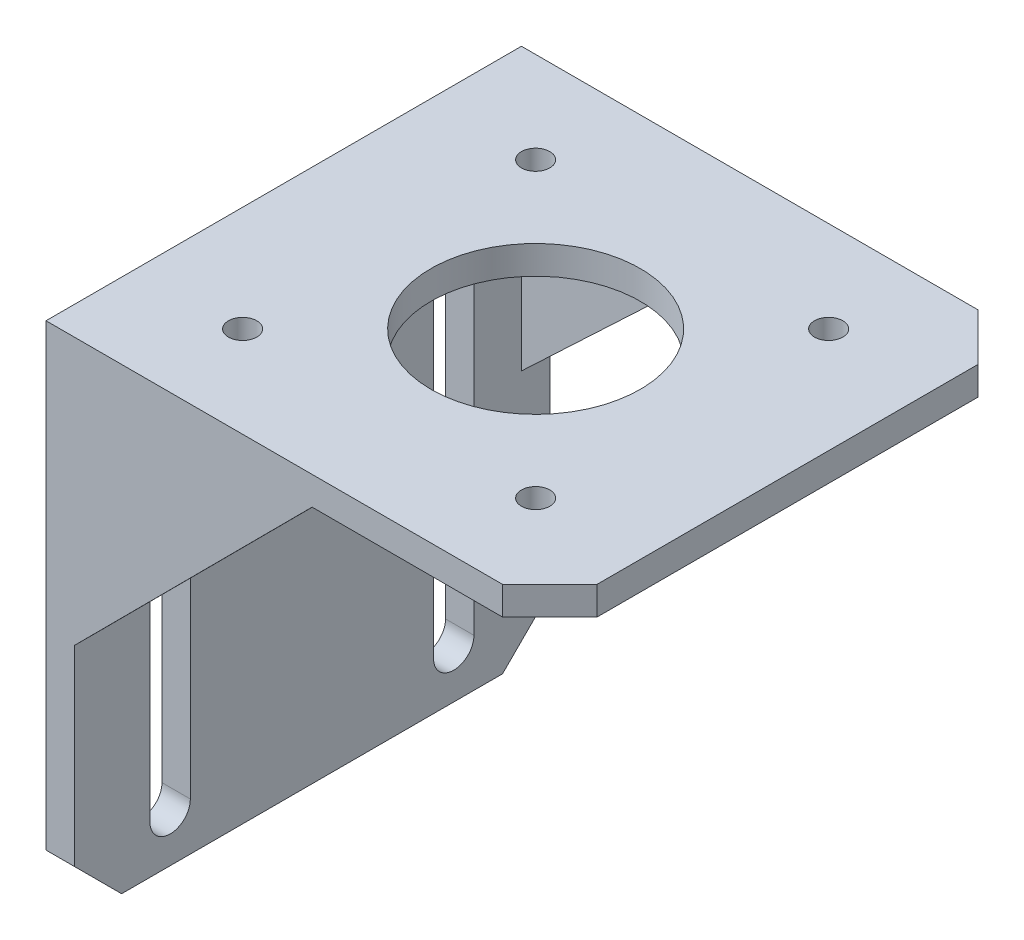
ISO-10303-21;
HEADER;
FILE_DESCRIPTION(('STEP AP214'),'2;1');
FILE_NAME('part.step','',(''),(''),'','','');
FILE_SCHEMA(('AUTOMOTIVE_DESIGN { 1 0 10303 214 1 1 1 1 }'));
ENDSEC;
DATA;
#1=APPLICATION_CONTEXT('core data for automotive mechanical design processes');
#2=APPLICATION_PROTOCOL_DEFINITION('international standard','automotive_design',2000,#1);
#3=PRODUCT_CONTEXT('',#1,'mechanical');
#4=PRODUCT('Part','Part','',(#3));
#5=PRODUCT_RELATED_PRODUCT_CATEGORY('part','',(#4));
#6=PRODUCT_DEFINITION_FORMATION('','',#4);
#7=PRODUCT_DEFINITION_CONTEXT('part definition',#1,'design');
#8=PRODUCT_DEFINITION('design','',#6,#7);
#9=PRODUCT_DEFINITION_SHAPE('','',#8);
#10=(LENGTH_UNIT() NAMED_UNIT(*) SI_UNIT(.MILLI.,.METRE.));
#11=(NAMED_UNIT(*) PLANE_ANGLE_UNIT() SI_UNIT($,.RADIAN.));
#12=(NAMED_UNIT(*) SI_UNIT($,.STERADIAN.) SOLID_ANGLE_UNIT());
#13=UNCERTAINTY_MEASURE_WITH_UNIT(LENGTH_MEASURE(1.E-05),#10,'distance_accuracy_value','');
#14=(GEOMETRIC_REPRESENTATION_CONTEXT(3) GLOBAL_UNCERTAINTY_ASSIGNED_CONTEXT((#13)) GLOBAL_UNIT_ASSIGNED_CONTEXT((#10,
#11,#12)) REPRESENTATION_CONTEXT('',''));
#15=CARTESIAN_POINT('',(0.,0.,0.));
#16=DIRECTION('',(0.,0.,1.));
#17=DIRECTION('',(1.,0.,0.));
#18=AXIS2_PLACEMENT_3D('',#15,#16,#17);
#19=CARTESIAN_POINT('',(3.,0.,0.));
#20=DIRECTION('',(1.,0.,0.));
#21=DIRECTION('',(0.,0.,-1.));
#22=AXIS2_PLACEMENT_3D('',#19,#20,#21);
#23=PLANE('',#22);
#24=DIRECTION('',(0.,0.,-1.));
#25=VECTOR('',#24,1.);
#26=CARTESIAN_POINT('',(3.,-29.863798217859,14.9988582977588));
#27=LINE('',#26,#25);
#28=CARTESIAN_POINT('',(3.,-29.863798217859,9.99885829775879));
#29=VERTEX_POINT('',#28);
#30=CARTESIAN_POINT('',(3.,-29.863798217859,-30.3011417022412));
#31=VERTEX_POINT('',#30);
#32=EDGE_CURVE('E310',#29,#31,#27,.T.);
#33=ORIENTED_EDGE('',*,*,#32,.T.);
#34=DIRECTION('',(0.,-0.707106781186547,0.707106781186549));
#35=VECTOR('',#34,1.);
#36=CARTESIAN_POINT('',(3.,-30.0824699600502,-30.0824699600501));
#37=LINE('',#36,#35);
#38=CARTESIAN_POINT('',(3.,-24.863798217859,-35.3011417022412));
#39=VERTEX_POINT('',#38);
#40=EDGE_CURVE('E11',#31,#39,#37,.F.);
#41=ORIENTED_EDGE('',*,*,#40,.T.);
#42=DIRECTION('',(0.,1.,0.));
#43=VECTOR('',#42,1.);
#44=CARTESIAN_POINT('',(3.,23.636201782141,-35.3011417022412));
#45=LINE('',#44,#43);
#46=CARTESIAN_POINT('',(3.,-3.113798217859,-35.3011417022412));
#47=VERTEX_POINT('',#46);
#48=EDGE_CURVE('E313',#39,#47,#45,.T.);
#49=ORIENTED_EDGE('',*,*,#48,.T.);
#50=DIRECTION('',(0.,0.,-1.));
#51=VECTOR('',#50,1.);
#52=CARTESIAN_POINT('',(3.,-3.11379821785901,-32.3011417022412));
#53=LINE('',#52,#51);
#54=CARTESIAN_POINT('',(3.,-3.11379821785901,-32.3011417022412));
#55=VERTEX_POINT('',#54);
#56=EDGE_CURVE('E197',#55,#47,#53,.T.);
#57=ORIENTED_EDGE('',*,*,#56,.F.);
#58=DIRECTION('',(0.,-1.,0.));
#59=VECTOR('',#58,1.);
#60=CARTESIAN_POINT('',(3.,20.636201782141,-32.3011417022412));
#61=LINE('',#60,#59);
#62=CARTESIAN_POINT('',(3.,20.636201782141,-32.3011417022412));
#63=VERTEX_POINT('',#62);
#64=EDGE_CURVE('E198',#63,#55,#61,.T.);
#65=ORIENTED_EDGE('',*,*,#64,.F.);
#66=DIRECTION('',(0.,0.,-1.));
#67=VECTOR('',#66,1.);
#68=CARTESIAN_POINT('',(3.,20.636201782141,14.9988582977588));
#69=LINE('',#68,#67);
#70=CARTESIAN_POINT('',(3.,20.636201782141,11.9988582977588));
#71=VERTEX_POINT('',#70);
#72=EDGE_CURVE('E209',#71,#63,#69,.T.);
#73=ORIENTED_EDGE('',*,*,#72,.F.);
#74=DIRECTION('',(0.,-1.,0.));
#75=VECTOR('',#74,1.);
#76=CARTESIAN_POINT('',(3.,20.636201782141,11.9988582977588));
#77=LINE('',#76,#75);
#78=CARTESIAN_POINT('',(3.,-4.613798217859,11.9988582977588));
#79=VERTEX_POINT('',#78);
#80=EDGE_CURVE('E222',#71,#79,#77,.T.);
#81=ORIENTED_EDGE('',*,*,#80,.T.);
#82=DIRECTION('',(0.,0.,1.));
#83=VECTOR('',#82,1.);
#84=CARTESIAN_POINT('',(3.,-4.613798217859,11.9988582977588));
#85=LINE('',#84,#83);
#86=CARTESIAN_POINT('',(3.,-4.613798217859,14.9988582977588));
#87=VERTEX_POINT('',#86);
#88=EDGE_CURVE('E227',#79,#87,#85,.T.);
#89=ORIENTED_EDGE('',*,*,#88,.T.);
#90=DIRECTION('',(0.,-1.,0.));
#91=VECTOR('',#90,1.);
#92=CARTESIAN_POINT('',(3.,23.636201782141,14.9988582977588));
#93=LINE('',#92,#91);
#94=CARTESIAN_POINT('',(3.,-24.863798217859,14.9988582977588));
#95=VERTEX_POINT('',#94);
#96=EDGE_CURVE('E307',#87,#95,#93,.T.);
#97=ORIENTED_EDGE('',*,*,#96,.T.);
#98=DIRECTION('',(0.,0.707106781186549,0.707106781186546));
#99=VECTOR('',#98,1.);
#100=CARTESIAN_POINT('',(3.,-19.9313282578088,19.9313282578089));
#101=LINE('',#100,#99);
#102=EDGE_CURVE('E354',#95,#29,#101,.F.);
#103=ORIENTED_EDGE('',*,*,#102,.T.);
#104=EDGE_LOOP('',(#33,#41,#49,#57,#65,#73,#81,#89,#97,#103));
#105=FACE_BOUND('',#104,.T.);
#106=DIRECTION('',(0.,-1.,0.));
#107=VECTOR('',#106,1.);
#108=CARTESIAN_POINT('',(3.,18.3151534002033,-23.0011417022412));
#109=LINE('',#108,#107);
#110=CARTESIAN_POINT('',(3.,18.3151534002033,-23.0011417022412));
#111=VERTEX_POINT('',#110);
#112=CARTESIAN_POINT('',(3.,-24.8184175519282,-23.0011417022412));
#113=VERTEX_POINT('',#112);
#114=EDGE_CURVE('E278',#111,#113,#109,.T.);
#115=ORIENTED_EDGE('',*,*,#114,.F.);
#116=CARTESIAN_POINT('',(3.,18.3151534002033,-25.1361417022412));
#117=DIRECTION('',(1.,0.,0.));
#118=DIRECTION('',(0.,0.,-1.));
#119=AXIS2_PLACEMENT_3D('',#116,#117,#118);
#120=CIRCLE('',#119,2.135);
#121=CARTESIAN_POINT('',(3.,18.3151534002033,-27.2711417022412));
#122=VERTEX_POINT('',#121);
#123=EDGE_CURVE('E276',#122,#111,#120,.T.);
#124=ORIENTED_EDGE('',*,*,#123,.F.);
#125=DIRECTION('',(0.,1.,0.));
#126=VECTOR('',#125,1.);
#127=CARTESIAN_POINT('',(3.,18.3151534002033,-27.2711417022412));
#128=LINE('',#127,#126);
#129=CARTESIAN_POINT('',(3.,-24.8184175519282,-27.2711417022412));
#130=VERTEX_POINT('',#129);
#131=EDGE_CURVE('E284',#130,#122,#128,.T.);
#132=ORIENTED_EDGE('',*,*,#131,.F.);
#133=CARTESIAN_POINT('',(3.,-24.8184175519282,-25.1361417022412));
#134=DIRECTION('',(1.,0.,0.));
#135=DIRECTION('',(0.,0.,-1.));
#136=AXIS2_PLACEMENT_3D('',#133,#134,#135);
#137=CIRCLE('',#136,2.135);
#138=EDGE_CURVE('E281',#113,#130,#137,.T.);
#139=ORIENTED_EDGE('',*,*,#138,.F.);
#140=EDGE_LOOP('',(#115,#124,#132,#139));
#141=FACE_BOUND('',#140,.T.);
#142=DIRECTION('',(0.,-1.,0.));
#143=VECTOR('',#142,1.);
#144=CARTESIAN_POINT('',(3.,-24.8184175519282,6.99885829775877));
#145=LINE('',#144,#143);
#146=CARTESIAN_POINT('',(3.,18.3151534002033,6.99885829775877));
#147=VERTEX_POINT('',#146);
#148=CARTESIAN_POINT('',(3.,-24.8184175519282,6.99885829775877));
#149=VERTEX_POINT('',#148);
#150=EDGE_CURVE('E247',#147,#149,#145,.T.);
#151=ORIENTED_EDGE('',*,*,#150,.F.);
#152=CARTESIAN_POINT('',(3.,18.3151534002033,4.86385829775877));
#153=DIRECTION('',(1.,0.,0.));
#154=DIRECTION('',(0.,0.,1.));
#155=AXIS2_PLACEMENT_3D('',#152,#153,#154);
#156=CIRCLE('',#155,2.135);
#157=CARTESIAN_POINT('',(3.,18.3151534002033,2.72885829775877));
#158=VERTEX_POINT('',#157);
#159=EDGE_CURVE('E245',#158,#147,#156,.T.);
#160=ORIENTED_EDGE('',*,*,#159,.F.);
#161=DIRECTION('',(0.,1.,0.));
#162=VECTOR('',#161,1.);
#163=CARTESIAN_POINT('',(3.,18.3151534002033,2.72885829775877));
#164=LINE('',#163,#162);
#165=CARTESIAN_POINT('',(3.,-24.8184175519282,2.72885829775877));
#166=VERTEX_POINT('',#165);
#167=EDGE_CURVE('E253',#166,#158,#164,.T.);
#168=ORIENTED_EDGE('',*,*,#167,.F.);
#169=CARTESIAN_POINT('',(3.,-24.8184175519282,4.86385829775877));
#170=DIRECTION('',(1.,0.,0.));
#171=DIRECTION('',(0.,0.,-1.));
#172=AXIS2_PLACEMENT_3D('',#169,#170,#171);
#173=CIRCLE('',#172,2.135);
#174=EDGE_CURVE('E250',#149,#166,#173,.T.);
#175=ORIENTED_EDGE('',*,*,#174,.F.);
#176=EDGE_LOOP('',(#151,#160,#168,#175));
#177=FACE_BOUND('',#176,.T.);
#178=ADVANCED_FACE('F36',(#105,#141,#177),#23,.T.);
#179=CARTESIAN_POINT('',(0.,0.,0.));
#180=DIRECTION('',(1.,0.,0.));
#181=DIRECTION('',(0.,0.,-1.));
#182=AXIS2_PLACEMENT_3D('',#179,#180,#181);
#183=PLANE('',#182);
#184=CARTESIAN_POINT('',(0.,18.3151534002033,-25.1361417022412));
#185=DIRECTION('',(1.,0.,0.));
#186=DIRECTION('',(0.,0.,-1.));
#187=AXIS2_PLACEMENT_3D('',#184,#185,#186);
#188=CIRCLE('',#187,2.135);
#189=CARTESIAN_POINT('',(0.,18.3151534002033,-27.2711417022412));
#190=VERTEX_POINT('',#189);
#191=CARTESIAN_POINT('',(0.,18.3151534002033,-23.0011417022412));
#192=VERTEX_POINT('',#191);
#193=EDGE_CURVE('E275',#190,#192,#188,.T.);
#194=ORIENTED_EDGE('',*,*,#193,.T.);
#195=DIRECTION('',(0.,-1.,0.));
#196=VECTOR('',#195,1.);
#197=CARTESIAN_POINT('',(0.,18.3151534002033,-23.0011417022412));
#198=LINE('',#197,#196);
#199=CARTESIAN_POINT('',(0.,-24.8184175519282,-23.0011417022412));
#200=VERTEX_POINT('',#199);
#201=EDGE_CURVE('E289',#192,#200,#198,.T.);
#202=ORIENTED_EDGE('',*,*,#201,.T.);
#203=CARTESIAN_POINT('',(0.,-24.8184175519282,-25.1361417022412));
#204=DIRECTION('',(1.,0.,0.));
#205=DIRECTION('',(0.,0.,-1.));
#206=AXIS2_PLACEMENT_3D('',#203,#204,#205);
#207=CIRCLE('',#206,2.135);
#208=CARTESIAN_POINT('',(0.,-24.8184175519282,-27.2711417022412));
#209=VERTEX_POINT('',#208);
#210=EDGE_CURVE('E292',#200,#209,#207,.T.);
#211=ORIENTED_EDGE('',*,*,#210,.T.);
#212=DIRECTION('',(0.,1.,0.));
#213=VECTOR('',#212,1.);
#214=CARTESIAN_POINT('',(0.,18.3151534002033,-27.2711417022412));
#215=LINE('',#214,#213);
#216=EDGE_CURVE('E279',#209,#190,#215,.T.);
#217=ORIENTED_EDGE('',*,*,#216,.T.);
#218=EDGE_LOOP('',(#194,#202,#211,#217));
#219=FACE_BOUND('',#218,.T.);
#220=DIRECTION('',(0.,1.,0.));
#221=VECTOR('',#220,1.);
#222=CARTESIAN_POINT('',(0.,23.636201782141,-35.3011417022412));
#223=LINE('',#222,#221);
#224=CARTESIAN_POINT('',(0.,-24.863798217859,-35.3011417022412));
#225=VERTEX_POINT('',#224);
#226=CARTESIAN_POINT('',(0.,23.636201782141,-35.3011417022412));
#227=VERTEX_POINT('',#226);
#228=EDGE_CURVE('E320',#225,#227,#223,.T.);
#229=ORIENTED_EDGE('',*,*,#228,.F.);
#230=DIRECTION('',(0.,0.707106781186547,-0.707106781186549));
#231=VECTOR('',#230,1.);
#232=CARTESIAN_POINT('',(0.,-24.863798217859,-35.3011417022412));
#233=LINE('',#232,#231);
#234=CARTESIAN_POINT('',(0.,-29.863798217859,-30.3011417022412));
#235=VERTEX_POINT('',#234);
#236=EDGE_CURVE('E58',#225,#235,#233,.F.);
#237=ORIENTED_EDGE('',*,*,#236,.T.);
#238=DIRECTION('',(0.,0.,-1.));
#239=VECTOR('',#238,1.);
#240=CARTESIAN_POINT('',(0.,-29.863798217859,14.9988582977588));
#241=LINE('',#240,#239);
#242=CARTESIAN_POINT('',(0.,-29.863798217859,9.99885829775879));
#243=VERTEX_POINT('',#242);
#244=EDGE_CURVE('E318',#243,#235,#241,.T.);
#245=ORIENTED_EDGE('',*,*,#244,.F.);
#246=DIRECTION('',(0.,-0.707106781186549,-0.707106781186546));
#247=VECTOR('',#246,1.);
#248=CARTESIAN_POINT('',(0.,-29.863798217859,9.99885829775879));
#249=LINE('',#248,#247);
#250=CARTESIAN_POINT('',(0.,-24.863798217859,14.9988582977588));
#251=VERTEX_POINT('',#250);
#252=EDGE_CURVE('E350',#243,#251,#249,.F.);
#253=ORIENTED_EDGE('',*,*,#252,.T.);
#254=DIRECTION('',(0.,-1.,0.));
#255=VECTOR('',#254,1.);
#256=CARTESIAN_POINT('',(0.,23.636201782141,14.9988582977588));
#257=LINE('',#256,#255);
#258=CARTESIAN_POINT('',(0.,23.636201782141,14.9988582977588));
#259=VERTEX_POINT('',#258);
#260=EDGE_CURVE('E306',#259,#251,#257,.T.);
#261=ORIENTED_EDGE('',*,*,#260,.F.);
#262=DIRECTION('',(0.,0.,1.));
#263=VECTOR('',#262,1.);
#264=CARTESIAN_POINT('',(0.,23.636201782141,14.9988582977588));
#265=LINE('',#264,#263);
#266=EDGE_CURVE('E311',#227,#259,#265,.T.);
#267=ORIENTED_EDGE('',*,*,#266,.F.);
#268=EDGE_LOOP('',(#229,#237,#245,#253,#261,#267));
#269=FACE_BOUND('',#268,.T.);
#270=CARTESIAN_POINT('',(0.,18.3151534002033,4.86385829775877));
#271=DIRECTION('',(1.,0.,0.));
#272=DIRECTION('',(0.,0.,1.));
#273=AXIS2_PLACEMENT_3D('',#270,#271,#272);
#274=CIRCLE('',#273,2.135);
#275=CARTESIAN_POINT('',(0.,18.3151534002033,2.72885829775877));
#276=VERTEX_POINT('',#275);
#277=CARTESIAN_POINT('',(0.,18.3151534002033,6.99885829775877));
#278=VERTEX_POINT('',#277);
#279=EDGE_CURVE('E244',#276,#278,#274,.T.);
#280=ORIENTED_EDGE('',*,*,#279,.T.);
#281=DIRECTION('',(0.,-1.,0.));
#282=VECTOR('',#281,1.);
#283=CARTESIAN_POINT('',(0.,-24.8184175519282,6.99885829775877));
#284=LINE('',#283,#282);
#285=CARTESIAN_POINT('',(0.,-24.8184175519282,6.99885829775877));
#286=VERTEX_POINT('',#285);
#287=EDGE_CURVE('E258',#278,#286,#284,.T.);
#288=ORIENTED_EDGE('',*,*,#287,.T.);
#289=CARTESIAN_POINT('',(0.,-24.8184175519282,4.86385829775877));
#290=DIRECTION('',(1.,0.,0.));
#291=DIRECTION('',(0.,0.,-1.));
#292=AXIS2_PLACEMENT_3D('',#289,#290,#291);
#293=CIRCLE('',#292,2.135);
#294=CARTESIAN_POINT('',(0.,-24.8184175519282,2.72885829775877));
#295=VERTEX_POINT('',#294);
#296=EDGE_CURVE('E261',#286,#295,#293,.T.);
#297=ORIENTED_EDGE('',*,*,#296,.T.);
#298=DIRECTION('',(0.,1.,0.));
#299=VECTOR('',#298,1.);
#300=CARTESIAN_POINT('',(0.,18.3151534002033,2.72885829775877));
#301=LINE('',#300,#299);
#302=EDGE_CURVE('E248',#295,#276,#301,.T.);
#303=ORIENTED_EDGE('',*,*,#302,.T.);
#304=EDGE_LOOP('',(#280,#288,#297,#303));
#305=FACE_BOUND('',#304,.T.);
#306=ADVANCED_FACE('F367',(#219,#269,#305),#183,.F.);
#307=CARTESIAN_POINT('',(3.,23.636201782141,14.9988582977588));
#308=DIRECTION('',(0.,0.,-1.));
#309=DIRECTION('',(0.,1.,0.));
#310=AXIS2_PLACEMENT_3D('',#307,#308,#309);
#311=PLANE('',#310);
#312=ORIENTED_EDGE('',*,*,#260,.T.);
#313=DIRECTION('',(1.,0.,0.));
#314=VECTOR('',#313,1.);
#315=CARTESIAN_POINT('',(3.,-24.863798217859,14.9988582977588));
#316=LINE('',#315,#314);
#317=EDGE_CURVE('E352',#251,#95,#316,.T.);
#318=ORIENTED_EDGE('',*,*,#317,.T.);
#319=ORIENTED_EDGE('',*,*,#96,.F.);
#320=DIRECTION('',(0.705702402452248,0.708508376219453,0.));
#321=VECTOR('',#320,1.);
#322=CARTESIAN_POINT('',(3.,-4.613798217859,14.9988582977588));
#323=LINE('',#322,#321);
#324=CARTESIAN_POINT('',(28.15,20.636201782141,14.9988582977588));
#325=VERTEX_POINT('',#324);
#326=EDGE_CURVE('E218',#87,#325,#323,.T.);
#327=ORIENTED_EDGE('',*,*,#326,.T.);
#328=DIRECTION('',(-1.,0.,0.));
#329=VECTOR('',#328,1.);
#330=CARTESIAN_POINT('',(53.3,20.636201782141,14.9988582977588));
#331=LINE('',#330,#329);
#332=CARTESIAN_POINT('',(48.3,20.636201782141,14.9988582977588));
#333=VERTEX_POINT('',#332);
#334=EDGE_CURVE('E242',#333,#325,#331,.T.);
#335=ORIENTED_EDGE('',*,*,#334,.F.);
#336=DIRECTION('',(0.,1.,0.));
#337=VECTOR('',#336,1.);
#338=CARTESIAN_POINT('',(48.3,23.636201782141,14.9988582977588));
#339=LINE('',#338,#337);
#340=CARTESIAN_POINT('',(48.3,23.636201782141,14.9988582977588));
#341=VERTEX_POINT('',#340);
#342=EDGE_CURVE('E343',#333,#341,#339,.T.);
#343=ORIENTED_EDGE('',*,*,#342,.T.);
#344=DIRECTION('',(-1.,0.,0.));
#345=VECTOR('',#344,1.);
#346=CARTESIAN_POINT('',(3.,23.636201782141,14.9988582977588));
#347=LINE('',#346,#345);
#348=EDGE_CURVE('E315',#341,#259,#347,.T.);
#349=ORIENTED_EDGE('',*,*,#348,.T.);
#350=EDGE_LOOP('',(#312,#318,#319,#327,#335,#343,#349));
#351=FACE_BOUND('',#350,.T.);
#352=ADVANCED_FACE('F388',(#351),#311,.F.);
#353=CARTESIAN_POINT('',(3.,-29.863798217859,14.9988582977588));
#354=DIRECTION('',(0.,1.,0.));
#355=DIRECTION('',(0.,0.,1.));
#356=AXIS2_PLACEMENT_3D('',#353,#354,#355);
#357=PLANE('',#356);
#358=ORIENTED_EDGE('',*,*,#244,.T.);
#359=DIRECTION('',(1.,0.,0.));
#360=VECTOR('',#359,1.);
#361=CARTESIAN_POINT('',(3.,-29.863798217859,-30.3011417022412));
#362=LINE('',#361,#360);
#363=EDGE_CURVE('E44',#235,#31,#362,.T.);
#364=ORIENTED_EDGE('',*,*,#363,.T.);
#365=ORIENTED_EDGE('',*,*,#32,.F.);
#366=DIRECTION('',(-1.,0.,0.));
#367=VECTOR('',#366,1.);
#368=CARTESIAN_POINT('',(3.,-29.863798217859,9.99885829775879));
#369=LINE('',#368,#367);
#370=EDGE_CURVE('E347',#29,#243,#369,.T.);
#371=ORIENTED_EDGE('',*,*,#370,.T.);
#372=EDGE_LOOP('',(#358,#364,#365,#371));
#373=FACE_BOUND('',#372,.T.);
#374=ADVANCED_FACE('F423',(#373),#357,.F.);
#375=CARTESIAN_POINT('',(3.,23.636201782141,-35.3011417022412));
#376=DIRECTION('',(0.,0.,1.));
#377=DIRECTION('',(0.,-1.,0.));
#378=AXIS2_PLACEMENT_3D('',#375,#376,#377);
#379=PLANE('',#378);
#380=ORIENTED_EDGE('',*,*,#48,.F.);
#381=DIRECTION('',(-1.,0.,0.));
#382=VECTOR('',#381,1.);
#383=CARTESIAN_POINT('',(3.,-24.863798217859,-35.3011417022412));
#384=LINE('',#383,#382);
#385=EDGE_CURVE('E356',#39,#225,#384,.T.);
#386=ORIENTED_EDGE('',*,*,#385,.T.);
#387=ORIENTED_EDGE('',*,*,#228,.T.);
#388=DIRECTION('',(-1.,0.,0.));
#389=VECTOR('',#388,1.);
#390=CARTESIAN_POINT('',(3.,23.636201782141,-35.3011417022412));
#391=LINE('',#390,#389);
#392=CARTESIAN_POINT('',(48.3,23.636201782141,-35.3011417022412));
#393=VERTEX_POINT('',#392);
#394=EDGE_CURVE('E325',#393,#227,#391,.T.);
#395=ORIENTED_EDGE('',*,*,#394,.F.);
#396=DIRECTION('',(0.,-1.,0.));
#397=VECTOR('',#396,1.);
#398=CARTESIAN_POINT('',(48.3,20.636201782141,-35.3011417022412));
#399=LINE('',#398,#397);
#400=CARTESIAN_POINT('',(48.3,20.636201782141,-35.3011417022412));
#401=VERTEX_POINT('',#400);
#402=EDGE_CURVE('E333',#393,#401,#399,.T.);
#403=ORIENTED_EDGE('',*,*,#402,.T.);
#404=DIRECTION('',(-1.,0.,0.));
#405=VECTOR('',#404,1.);
#406=CARTESIAN_POINT('',(53.3,20.636201782141,-35.3011417022412));
#407=LINE('',#406,#405);
#408=CARTESIAN_POINT('',(28.15,20.636201782141,-35.3011417022412));
#409=VERTEX_POINT('',#408);
#410=EDGE_CURVE('E239',#401,#409,#407,.T.);
#411=ORIENTED_EDGE('',*,*,#410,.T.);
#412=DIRECTION('',(-0.727053236752637,-0.686581088384696,0.));
#413=VECTOR('',#412,1.);
#414=CARTESIAN_POINT('',(28.15,20.636201782141,-35.3011417022412));
#415=LINE('',#414,#413);
#416=EDGE_CURVE('E193',#409,#47,#415,.T.);
#417=ORIENTED_EDGE('',*,*,#416,.T.);
#418=EDGE_LOOP('',(#380,#386,#387,#395,#403,#411,#417));
#419=FACE_BOUND('',#418,.T.);
#420=ADVANCED_FACE('F362',(#419),#379,.F.);
#421=CARTESIAN_POINT('',(3.,23.636201782141,14.9988582977588));
#422=DIRECTION('',(0.,-1.,0.));
#423=DIRECTION('',(0.,0.,-1.));
#424=AXIS2_PLACEMENT_3D('',#421,#422,#423);
#425=PLANE('',#424);
#426=CARTESIAN_POINT('',(42.15,23.636201782141,5.34885829775878));
#427=DIRECTION('',(0.,1.,0.));
#428=DIRECTION('',(0.,0.,1.));
#429=AXIS2_PLACEMENT_3D('',#426,#427,#428);
#430=CIRCLE('',#429,1.5);
#431=CARTESIAN_POINT('',(42.15,23.636201782141,6.84885829775878));
#432=VERTEX_POINT('',#431);
#433=EDGE_CURVE('E643',#432,#432,#430,.T.);
#434=ORIENTED_EDGE('',*,*,#433,.F.);
#435=EDGE_LOOP('',(#434));
#436=FACE_BOUND('',#435,.T.);
#437=CARTESIAN_POINT('',(11.15,23.636201782141,-25.6511417022412));
#438=DIRECTION('',(0.,1.,0.));
#439=DIRECTION('',(0.,0.,1.));
#440=AXIS2_PLACEMENT_3D('',#437,#438,#439);
#441=CIRCLE('',#440,1.5);
#442=CARTESIAN_POINT('',(11.15,23.636201782141,-24.1511417022412));
#443=VERTEX_POINT('',#442);
#444=EDGE_CURVE('E648',#443,#443,#441,.T.);
#445=ORIENTED_EDGE('',*,*,#444,.F.);
#446=EDGE_LOOP('',(#445));
#447=FACE_BOUND('',#446,.T.);
#448=CARTESIAN_POINT('',(11.15,23.636201782141,5.34885829775878));
#449=DIRECTION('',(0.,1.,0.));
#450=DIRECTION('',(0.,0.,1.));
#451=AXIS2_PLACEMENT_3D('',#448,#449,#450);
#452=CIRCLE('',#451,1.5);
#453=CARTESIAN_POINT('',(11.15,23.636201782141,6.84885829775878));
#454=VERTEX_POINT('',#453);
#455=EDGE_CURVE('E664',#454,#454,#452,.T.);
#456=ORIENTED_EDGE('',*,*,#455,.F.);
#457=EDGE_LOOP('',(#456));
#458=FACE_BOUND('',#457,.T.);
#459=CARTESIAN_POINT('',(26.65,23.636201782141,-10.1511417022412));
#460=DIRECTION('',(0.,1.,0.));
#461=DIRECTION('',(0.,0.,1.));
#462=AXIS2_PLACEMENT_3D('',#459,#460,#461);
#463=CIRCLE('',#462,11.075);
#464=CARTESIAN_POINT('',(26.65,23.636201782141,0.923858297758776));
#465=VERTEX_POINT('',#464);
#466=EDGE_CURVE('E673',#465,#465,#463,.T.);
#467=ORIENTED_EDGE('',*,*,#466,.F.);
#468=EDGE_LOOP('',(#467));
#469=FACE_BOUND('',#468,.T.);
#470=CARTESIAN_POINT('',(42.15,23.636201782141,-25.6511417022412));
#471=DIRECTION('',(0.,1.,0.));
#472=DIRECTION('',(0.,0.,1.));
#473=AXIS2_PLACEMENT_3D('',#470,#471,#472);
#474=CIRCLE('',#473,1.5);
#475=CARTESIAN_POINT('',(42.15,23.636201782141,-24.1511417022412));
#476=VERTEX_POINT('',#475);
#477=EDGE_CURVE('E214',#476,#476,#474,.T.);
#478=ORIENTED_EDGE('',*,*,#477,.F.);
#479=EDGE_LOOP('',(#478));
#480=FACE_BOUND('',#479,.T.);
#481=ORIENTED_EDGE('',*,*,#348,.F.);
#482=DIRECTION('',(0.707106781186549,0.,-0.707106781186547));
#483=VECTOR('',#482,1.);
#484=CARTESIAN_POINT('',(53.3,23.636201782141,9.99885829775878));
#485=LINE('',#484,#483);
#486=CARTESIAN_POINT('',(53.3,23.636201782141,9.99885829775878));
#487=VERTEX_POINT('',#486);
#488=EDGE_CURVE('E345',#341,#487,#485,.T.);
#489=ORIENTED_EDGE('',*,*,#488,.T.);
#490=DIRECTION('',(0.,0.,1.));
#491=VECTOR('',#490,1.);
#492=CARTESIAN_POINT('',(53.3,23.636201782141,14.9988582977588));
#493=LINE('',#492,#491);
#494=CARTESIAN_POINT('',(53.3,23.636201782141,-30.3011417022412));
#495=VERTEX_POINT('',#494);
#496=EDGE_CURVE('E236',#495,#487,#493,.T.);
#497=ORIENTED_EDGE('',*,*,#496,.F.);
#498=DIRECTION('',(-0.70710678118655,0.,-0.707106781186546));
#499=VECTOR('',#498,1.);
#500=CARTESIAN_POINT('',(53.3,23.636201782141,-30.3011417022412));
#501=LINE('',#500,#499);
#502=EDGE_CURVE('E331',#495,#393,#501,.T.);
#503=ORIENTED_EDGE('',*,*,#502,.T.);
#504=ORIENTED_EDGE('',*,*,#394,.T.);
#505=ORIENTED_EDGE('',*,*,#266,.T.);
#506=EDGE_LOOP('',(#481,#489,#497,#503,#504,#505));
#507=FACE_BOUND('',#506,.T.);
#508=ADVANCED_FACE('F372',(#436,#447,#458,#469,#480,#507),#425,.F.);
#509=CARTESIAN_POINT('',(3.,18.3151534002033,-25.1361417022412));
#510=DIRECTION('',(-1.,0.,0.));
#511=DIRECTION('',(0.,0.,1.));
#512=AXIS2_PLACEMENT_3D('',#509,#510,#511);
#513=CYLINDRICAL_SURFACE('',#512,2.135);
#514=ORIENTED_EDGE('',*,*,#193,.F.);
#515=DIRECTION('',(-1.,0.,0.));
#516=VECTOR('',#515,1.);
#517=CARTESIAN_POINT('',(3.,18.3151534002033,-27.2711417022412));
#518=LINE('',#517,#516);
#519=EDGE_CURVE('E286',#122,#190,#518,.T.);
#520=ORIENTED_EDGE('',*,*,#519,.F.);
#521=ORIENTED_EDGE('',*,*,#123,.T.);
#522=DIRECTION('',(-1.,0.,0.));
#523=VECTOR('',#522,1.);
#524=CARTESIAN_POINT('',(3.,18.3151534002033,-23.0011417022412));
#525=LINE('',#524,#523);
#526=EDGE_CURVE('E303',#111,#192,#525,.T.);
#527=ORIENTED_EDGE('',*,*,#526,.T.);
#528=EDGE_LOOP('',(#514,#520,#521,#527));
#529=FACE_BOUND('',#528,.T.);
#530=ADVANCED_FACE('F415',(#529),#513,.F.);
#531=CARTESIAN_POINT('',(3.,18.3151534002033,-23.0011417022412));
#532=DIRECTION('',(0.,0.,-1.));
#533=DIRECTION('',(-1.,0.,0.));
#534=AXIS2_PLACEMENT_3D('',#531,#532,#533);
#535=PLANE('',#534);
#536=ORIENTED_EDGE('',*,*,#201,.F.);
#537=ORIENTED_EDGE('',*,*,#526,.F.);
#538=ORIENTED_EDGE('',*,*,#114,.T.);
#539=DIRECTION('',(-1.,0.,0.));
#540=VECTOR('',#539,1.);
#541=CARTESIAN_POINT('',(3.,-24.8184175519282,-23.0011417022412));
#542=LINE('',#541,#540);
#543=EDGE_CURVE('E301',#113,#200,#542,.T.);
#544=ORIENTED_EDGE('',*,*,#543,.T.);
#545=EDGE_LOOP('',(#536,#537,#538,#544));
#546=FACE_BOUND('',#545,.T.);
#547=ADVANCED_FACE('F489',(#546),#535,.T.);
#548=CARTESIAN_POINT('',(3.,-24.8184175519282,-25.1361417022412));
#549=DIRECTION('',(-1.,0.,0.));
#550=DIRECTION('',(0.,0.,1.));
#551=AXIS2_PLACEMENT_3D('',#548,#549,#550);
#552=CYLINDRICAL_SURFACE('',#551,2.135);
#553=ORIENTED_EDGE('',*,*,#210,.F.);
#554=ORIENTED_EDGE('',*,*,#543,.F.);
#555=ORIENTED_EDGE('',*,*,#138,.T.);
#556=DIRECTION('',(-1.,0.,0.));
#557=VECTOR('',#556,1.);
#558=CARTESIAN_POINT('',(3.,-24.8184175519282,-27.2711417022412));
#559=LINE('',#558,#557);
#560=EDGE_CURVE('E299',#130,#209,#559,.T.);
#561=ORIENTED_EDGE('',*,*,#560,.T.);
#562=EDGE_LOOP('',(#553,#554,#555,#561));
#563=FACE_BOUND('',#562,.T.);
#564=ADVANCED_FACE('F496',(#563),#552,.F.);
#565=CARTESIAN_POINT('',(3.,18.3151534002033,-27.2711417022412));
#566=DIRECTION('',(0.,0.,1.));
#567=DIRECTION('',(1.,0.,0.));
#568=AXIS2_PLACEMENT_3D('',#565,#566,#567);
#569=PLANE('',#568);
#570=ORIENTED_EDGE('',*,*,#216,.F.);
#571=ORIENTED_EDGE('',*,*,#560,.F.);
#572=ORIENTED_EDGE('',*,*,#131,.T.);
#573=ORIENTED_EDGE('',*,*,#519,.T.);
#574=EDGE_LOOP('',(#570,#571,#572,#573));
#575=FACE_BOUND('',#574,.T.);
#576=ADVANCED_FACE('F503',(#575),#569,.T.);
#577=CARTESIAN_POINT('',(3.,18.3151534002033,4.86385829775877));
#578=DIRECTION('',(-1.,0.,0.));
#579=DIRECTION('',(0.,0.,1.));
#580=AXIS2_PLACEMENT_3D('',#577,#578,#579);
#581=CYLINDRICAL_SURFACE('',#580,2.135);
#582=ORIENTED_EDGE('',*,*,#279,.F.);
#583=DIRECTION('',(-1.,0.,0.));
#584=VECTOR('',#583,1.);
#585=CARTESIAN_POINT('',(3.,18.3151534002033,2.72885829775877));
#586=LINE('',#585,#584);
#587=EDGE_CURVE('E255',#158,#276,#586,.T.);
#588=ORIENTED_EDGE('',*,*,#587,.F.);
#589=ORIENTED_EDGE('',*,*,#159,.T.);
#590=DIRECTION('',(-1.,0.,0.));
#591=VECTOR('',#590,1.);
#592=CARTESIAN_POINT('',(3.,18.3151534002033,6.99885829775877));
#593=LINE('',#592,#591);
#594=EDGE_CURVE('E272',#147,#278,#593,.T.);
#595=ORIENTED_EDGE('',*,*,#594,.T.);
#596=EDGE_LOOP('',(#582,#588,#589,#595));
#597=FACE_BOUND('',#596,.T.);
#598=ADVANCED_FACE('F511',(#597),#581,.F.);
#599=CARTESIAN_POINT('',(3.,-24.8184175519282,6.99885829775877));
#600=DIRECTION('',(0.,0.,-1.));
#601=DIRECTION('',(-1.,0.,0.));
#602=AXIS2_PLACEMENT_3D('',#599,#600,#601);
#603=PLANE('',#602);
#604=ORIENTED_EDGE('',*,*,#287,.F.);
#605=ORIENTED_EDGE('',*,*,#594,.F.);
#606=ORIENTED_EDGE('',*,*,#150,.T.);
#607=DIRECTION('',(-1.,0.,0.));
#608=VECTOR('',#607,1.);
#609=CARTESIAN_POINT('',(3.,-24.8184175519282,6.99885829775877));
#610=LINE('',#609,#608);
#611=EDGE_CURVE('E270',#149,#286,#610,.T.);
#612=ORIENTED_EDGE('',*,*,#611,.T.);
#613=EDGE_LOOP('',(#604,#605,#606,#612));
#614=FACE_BOUND('',#613,.T.);
#615=ADVANCED_FACE('F519',(#614),#603,.T.);
#616=CARTESIAN_POINT('',(3.,-24.8184175519282,4.86385829775877));
#617=DIRECTION('',(-1.,0.,0.));
#618=DIRECTION('',(0.,0.,1.));
#619=AXIS2_PLACEMENT_3D('',#616,#617,#618);
#620=CYLINDRICAL_SURFACE('',#619,2.135);
#621=ORIENTED_EDGE('',*,*,#296,.F.);
#622=ORIENTED_EDGE('',*,*,#611,.F.);
#623=ORIENTED_EDGE('',*,*,#174,.T.);
#624=DIRECTION('',(-1.,0.,0.));
#625=VECTOR('',#624,1.);
#626=CARTESIAN_POINT('',(3.,-24.8184175519282,2.72885829775877));
#627=LINE('',#626,#625);
#628=EDGE_CURVE('E268',#166,#295,#627,.T.);
#629=ORIENTED_EDGE('',*,*,#628,.T.);
#630=EDGE_LOOP('',(#621,#622,#623,#629));
#631=FACE_BOUND('',#630,.T.);
#632=ADVANCED_FACE('F527',(#631),#620,.F.);
#633=CARTESIAN_POINT('',(3.,18.3151534002033,2.72885829775877));
#634=DIRECTION('',(0.,0.,1.));
#635=DIRECTION('',(1.,0.,0.));
#636=AXIS2_PLACEMENT_3D('',#633,#634,#635);
#637=PLANE('',#636);
#638=ORIENTED_EDGE('',*,*,#302,.F.);
#639=ORIENTED_EDGE('',*,*,#628,.F.);
#640=ORIENTED_EDGE('',*,*,#167,.T.);
#641=ORIENTED_EDGE('',*,*,#587,.T.);
#642=EDGE_LOOP('',(#638,#639,#640,#641));
#643=FACE_BOUND('',#642,.T.);
#644=ADVANCED_FACE('F535',(#643),#637,.T.);
#645=CARTESIAN_POINT('',(53.3,20.636201782141,14.9988582977588));
#646=DIRECTION('',(0.,1.,0.));
#647=DIRECTION('',(0.,0.,1.));
#648=AXIS2_PLACEMENT_3D('',#645,#646,#647);
#649=PLANE('',#648);
#650=CARTESIAN_POINT('',(42.15,20.636201782141,5.34885829775878));
#651=DIRECTION('',(0.,1.,0.));
#652=DIRECTION('',(0.,0.,1.));
#653=AXIS2_PLACEMENT_3D('',#650,#651,#652);
#654=CIRCLE('',#653,1.5);
#655=CARTESIAN_POINT('',(42.15,20.636201782141,6.84885829775878));
#656=VERTEX_POINT('',#655);
#657=EDGE_CURVE('E640',#656,#656,#654,.T.);
#658=ORIENTED_EDGE('',*,*,#657,.T.);
#659=EDGE_LOOP('',(#658));
#660=FACE_BOUND('',#659,.T.);
#661=CARTESIAN_POINT('',(11.15,20.636201782141,-25.6511417022412));
#662=DIRECTION('',(0.,1.,0.));
#663=DIRECTION('',(0.,0.,1.));
#664=AXIS2_PLACEMENT_3D('',#661,#662,#663);
#665=CIRCLE('',#664,1.5);
#666=CARTESIAN_POINT('',(11.15,20.636201782141,-24.1511417022412));
#667=VERTEX_POINT('',#666);
#668=EDGE_CURVE('E644',#667,#667,#665,.T.);
#669=ORIENTED_EDGE('',*,*,#668,.T.);
#670=EDGE_LOOP('',(#669));
#671=FACE_BOUND('',#670,.T.);
#672=CARTESIAN_POINT('',(11.15,20.636201782141,5.34885829775878));
#673=DIRECTION('',(0.,1.,0.));
#674=DIRECTION('',(0.,0.,1.));
#675=AXIS2_PLACEMENT_3D('',#672,#673,#674);
#676=CIRCLE('',#675,1.5);
#677=CARTESIAN_POINT('',(11.15,20.636201782141,6.84885829775878));
#678=VERTEX_POINT('',#677);
#679=EDGE_CURVE('E653',#678,#678,#676,.T.);
#680=ORIENTED_EDGE('',*,*,#679,.T.);
#681=EDGE_LOOP('',(#680));
#682=FACE_BOUND('',#681,.T.);
#683=CARTESIAN_POINT('',(26.65,20.636201782141,-10.1511417022412));
#684=DIRECTION('',(0.,1.,0.));
#685=DIRECTION('',(0.,0.,1.));
#686=AXIS2_PLACEMENT_3D('',#683,#684,#685);
#687=CIRCLE('',#686,11.075);
#688=CARTESIAN_POINT('',(26.65,20.636201782141,0.923858297758776));
#689=VERTEX_POINT('',#688);
#690=EDGE_CURVE('E669',#689,#689,#687,.T.);
#691=ORIENTED_EDGE('',*,*,#690,.T.);
#692=EDGE_LOOP('',(#691));
#693=FACE_BOUND('',#692,.T.);
#694=CARTESIAN_POINT('',(42.15,20.636201782141,-25.6511417022412));
#695=DIRECTION('',(0.,1.,0.));
#696=DIRECTION('',(0.,0.,1.));
#697=AXIS2_PLACEMENT_3D('',#694,#695,#696);
#698=CIRCLE('',#697,1.5);
#699=CARTESIAN_POINT('',(42.15,20.636201782141,-24.1511417022412));
#700=VERTEX_POINT('',#699);
#701=EDGE_CURVE('E211',#700,#700,#698,.T.);
#702=ORIENTED_EDGE('',*,*,#701,.T.);
#703=EDGE_LOOP('',(#702));
#704=FACE_BOUND('',#703,.T.);
#705=DIRECTION('',(0.,0.,-1.));
#706=VECTOR('',#705,1.);
#707=CARTESIAN_POINT('',(53.3,20.636201782141,14.9988582977588));
#708=LINE('',#707,#706);
#709=CARTESIAN_POINT('',(53.3,20.636201782141,9.99885829775878));
#710=VERTEX_POINT('',#709);
#711=CARTESIAN_POINT('',(53.3,20.636201782141,-30.3011417022412));
#712=VERTEX_POINT('',#711);
#713=EDGE_CURVE('E234',#710,#712,#708,.T.);
#714=ORIENTED_EDGE('',*,*,#713,.F.);
#715=DIRECTION('',(-0.707106781186548,0.,0.707106781186546));
#716=VECTOR('',#715,1.);
#717=CARTESIAN_POINT('',(53.3,20.636201782141,9.99885829775878));
#718=LINE('',#717,#716);
#719=EDGE_CURVE('E341',#710,#333,#718,.T.);
#720=ORIENTED_EDGE('',*,*,#719,.T.);
#721=ORIENTED_EDGE('',*,*,#334,.T.);
#722=DIRECTION('',(0.,0.,1.));
#723=VECTOR('',#722,1.);
#724=CARTESIAN_POINT('',(28.15,20.636201782141,11.9988582977588));
#725=LINE('',#724,#723);
#726=CARTESIAN_POINT('',(28.15,20.636201782141,11.9988582977588));
#727=VERTEX_POINT('',#726);
#728=EDGE_CURVE('E230',#727,#325,#725,.T.);
#729=ORIENTED_EDGE('',*,*,#728,.F.);
#730=DIRECTION('',(-1.,0.,0.));
#731=VECTOR('',#730,1.);
#732=CARTESIAN_POINT('',(28.15,20.636201782141,11.9988582977588));
#733=LINE('',#732,#731);
#734=EDGE_CURVE('E220',#727,#71,#733,.T.);
#735=ORIENTED_EDGE('',*,*,#734,.T.);
#736=ORIENTED_EDGE('',*,*,#72,.T.);
#737=DIRECTION('',(1.,0.,0.));
#738=VECTOR('',#737,1.);
#739=CARTESIAN_POINT('',(3.,20.636201782141,-32.3011417022412));
#740=LINE('',#739,#738);
#741=CARTESIAN_POINT('',(28.15,20.636201782141,-32.3011417022412));
#742=VERTEX_POINT('',#741);
#743=EDGE_CURVE('E202',#63,#742,#740,.T.);
#744=ORIENTED_EDGE('',*,*,#743,.T.);
#745=DIRECTION('',(0.,0.,-1.));
#746=VECTOR('',#745,1.);
#747=CARTESIAN_POINT('',(28.15,20.636201782141,-32.3011417022412));
#748=LINE('',#747,#746);
#749=EDGE_CURVE('E186',#742,#409,#748,.T.);
#750=ORIENTED_EDGE('',*,*,#749,.T.);
#751=ORIENTED_EDGE('',*,*,#410,.F.);
#752=DIRECTION('',(0.707106781186549,0.,0.707106781186545));
#753=VECTOR('',#752,1.);
#754=CARTESIAN_POINT('',(53.3,20.636201782141,-30.3011417022412));
#755=LINE('',#754,#753);
#756=EDGE_CURVE('E335',#401,#712,#755,.T.);
#757=ORIENTED_EDGE('',*,*,#756,.T.);
#758=EDGE_LOOP('',(#714,#720,#721,#729,#735,#736,#744,#750,#751,#757));
#759=FACE_BOUND('',#758,.T.);
#760=ADVANCED_FACE('F207',(#660,#671,#682,#693,#704,#759),#649,.F.);
#761=CARTESIAN_POINT('',(53.3,0.,0.));
#762=DIRECTION('',(1.,0.,0.));
#763=DIRECTION('',(0.,0.,-1.));
#764=AXIS2_PLACEMENT_3D('',#761,#762,#763);
#765=PLANE('',#764);
#766=ORIENTED_EDGE('',*,*,#496,.T.);
#767=DIRECTION('',(0.,-1.,0.));
#768=VECTOR('',#767,1.);
#769=CARTESIAN_POINT('',(53.3,20.636201782141,9.99885829775878));
#770=LINE('',#769,#768);
#771=EDGE_CURVE('E338',#487,#710,#770,.T.);
#772=ORIENTED_EDGE('',*,*,#771,.T.);
#773=ORIENTED_EDGE('',*,*,#713,.T.);
#774=DIRECTION('',(0.,1.,0.));
#775=VECTOR('',#774,1.);
#776=CARTESIAN_POINT('',(53.3,23.636201782141,-30.3011417022412));
#777=LINE('',#776,#775);
#778=EDGE_CURVE('E328',#712,#495,#777,.T.);
#779=ORIENTED_EDGE('',*,*,#778,.T.);
#780=EDGE_LOOP('',(#766,#772,#773,#779));
#781=FACE_BOUND('',#780,.T.);
#782=ADVANCED_FACE('F382',(#781),#765,.T.);
#783=CARTESIAN_POINT('',(3.,-4.613798217859,11.9988582977588));
#784=DIRECTION('',(0.708508376219453,-0.705702402452247,0.));
#785=DIRECTION('',(0.705702402452248,0.708508376219453,0.));
#786=AXIS2_PLACEMENT_3D('',#783,#784,#785);
#787=PLANE('',#786);
#788=ORIENTED_EDGE('',*,*,#326,.F.);
#789=ORIENTED_EDGE('',*,*,#88,.F.);
#790=DIRECTION('',(0.705702402452248,0.708508376219453,0.));
#791=VECTOR('',#790,1.);
#792=CARTESIAN_POINT('',(3.,-4.613798217859,11.9988582977588));
#793=LINE('',#792,#791);
#794=EDGE_CURVE('E224',#79,#727,#793,.T.);
#795=ORIENTED_EDGE('',*,*,#794,.T.);
#796=ORIENTED_EDGE('',*,*,#728,.T.);
#797=EDGE_LOOP('',(#788,#789,#795,#796));
#798=FACE_BOUND('',#797,.T.);
#799=ADVANCED_FACE('F393',(#798),#787,.T.);
#800=CARTESIAN_POINT('',(0.,0.,11.9988582977588));
#801=DIRECTION('',(0.,0.,1.));
#802=DIRECTION('',(1.,0.,0.));
#803=AXIS2_PLACEMENT_3D('',#800,#801,#802);
#804=PLANE('',#803);
#805=ORIENTED_EDGE('',*,*,#734,.F.);
#806=ORIENTED_EDGE('',*,*,#794,.F.);
#807=ORIENTED_EDGE('',*,*,#80,.F.);
#808=EDGE_LOOP('',(#805,#806,#807));
#809=FACE_BOUND('',#808,.T.);
#810=ADVANCED_FACE('F398',(#809),#804,.F.);
#811=CARTESIAN_POINT('',(28.15,20.636201782141,-32.3011417022412));
#812=DIRECTION('',(0.686581088384696,-0.727053236752637,0.));
#813=DIRECTION('',(0.727053236752637,0.686581088384696,0.));
#814=AXIS2_PLACEMENT_3D('',#811,#812,#813);
#815=PLANE('',#814);
#816=ORIENTED_EDGE('',*,*,#416,.F.);
#817=ORIENTED_EDGE('',*,*,#749,.F.);
#818=DIRECTION('',(-0.727053236752637,-0.686581088384696,0.));
#819=VECTOR('',#818,1.);
#820=CARTESIAN_POINT('',(28.15,20.636201782141,-32.3011417022412));
#821=LINE('',#820,#819);
#822=EDGE_CURVE('E190',#742,#55,#821,.T.);
#823=ORIENTED_EDGE('',*,*,#822,.T.);
#824=ORIENTED_EDGE('',*,*,#56,.T.);
#825=EDGE_LOOP('',(#816,#817,#823,#824));
#826=FACE_BOUND('',#825,.T.);
#827=ADVANCED_FACE('F188',(#826),#815,.T.);
#828=CARTESIAN_POINT('',(0.,0.,-32.3011417022412));
#829=DIRECTION('',(0.,0.,-1.));
#830=DIRECTION('',(-1.,0.,0.));
#831=AXIS2_PLACEMENT_3D('',#828,#829,#830);
#832=PLANE('',#831);
#833=ORIENTED_EDGE('',*,*,#743,.F.);
#834=ORIENTED_EDGE('',*,*,#64,.T.);
#835=ORIENTED_EDGE('',*,*,#822,.F.);
#836=EDGE_LOOP('',(#833,#834,#835));
#837=FACE_BOUND('',#836,.T.);
#838=ADVANCED_FACE('F201',(#837),#832,.F.);
#839=CARTESIAN_POINT('',(42.15,20.636201782141,-25.6511417022412));
#840=DIRECTION('',(0.,1.,0.));
#841=DIRECTION('',(0.,0.,1.));
#842=AXIS2_PLACEMENT_3D('',#839,#840,#841);
#843=CYLINDRICAL_SURFACE('',#842,1.5);
#844=ORIENTED_EDGE('',*,*,#701,.F.);
#845=EDGE_LOOP('',(#844));
#846=FACE_BOUND('',#845,.T.);
#847=ORIENTED_EDGE('',*,*,#477,.T.);
#848=EDGE_LOOP('',(#847));
#849=FACE_BOUND('',#848,.T.);
#850=ADVANCED_FACE('F577',(#846,#849),#843,.F.);
#851=CARTESIAN_POINT('',(26.65,20.636201782141,-10.1511417022412));
#852=DIRECTION('',(0.,1.,0.));
#853=DIRECTION('',(0.,0.,1.));
#854=AXIS2_PLACEMENT_3D('',#851,#852,#853);
#855=CYLINDRICAL_SURFACE('',#854,11.075);
#856=ORIENTED_EDGE('',*,*,#690,.F.);
#857=EDGE_LOOP('',(#856));
#858=FACE_BOUND('',#857,.T.);
#859=ORIENTED_EDGE('',*,*,#466,.T.);
#860=EDGE_LOOP('',(#859));
#861=FACE_BOUND('',#860,.T.);
#862=ADVANCED_FACE('F584',(#858,#861),#855,.F.);
#863=CARTESIAN_POINT('',(11.15,20.636201782141,5.34885829775878));
#864=DIRECTION('',(0.,1.,0.));
#865=DIRECTION('',(0.,0.,1.));
#866=AXIS2_PLACEMENT_3D('',#863,#864,#865);
#867=CYLINDRICAL_SURFACE('',#866,1.5);
#868=ORIENTED_EDGE('',*,*,#679,.F.);
#869=EDGE_LOOP('',(#868));
#870=FACE_BOUND('',#869,.T.);
#871=ORIENTED_EDGE('',*,*,#455,.T.);
#872=EDGE_LOOP('',(#871));
#873=FACE_BOUND('',#872,.T.);
#874=ADVANCED_FACE('F592',(#870,#873),#867,.F.);
#875=CARTESIAN_POINT('',(11.15,20.636201782141,-25.6511417022412));
#876=DIRECTION('',(0.,1.,0.));
#877=DIRECTION('',(0.,0.,1.));
#878=AXIS2_PLACEMENT_3D('',#875,#876,#877);
#879=CYLINDRICAL_SURFACE('',#878,1.5);
#880=ORIENTED_EDGE('',*,*,#668,.F.);
#881=EDGE_LOOP('',(#880));
#882=FACE_BOUND('',#881,.T.);
#883=ORIENTED_EDGE('',*,*,#444,.T.);
#884=EDGE_LOOP('',(#883));
#885=FACE_BOUND('',#884,.T.);
#886=ADVANCED_FACE('F600',(#882,#885),#879,.F.);
#887=CARTESIAN_POINT('',(42.15,20.636201782141,5.34885829775878));
#888=DIRECTION('',(0.,1.,0.));
#889=DIRECTION('',(0.,0.,1.));
#890=AXIS2_PLACEMENT_3D('',#887,#888,#889);
#891=CYLINDRICAL_SURFACE('',#890,1.5);
#892=ORIENTED_EDGE('',*,*,#657,.F.);
#893=EDGE_LOOP('',(#892));
#894=FACE_BOUND('',#893,.T.);
#895=ORIENTED_EDGE('',*,*,#433,.T.);
#896=EDGE_LOOP('',(#895));
#897=FACE_BOUND('',#896,.T.);
#898=ADVANCED_FACE('F430',(#894,#897),#891,.F.);
#899=CARTESIAN_POINT('',(53.3,0.,-30.3011417022412));
#900=DIRECTION('',(0.707106781186545,0.,-0.707106781186549));
#901=DIRECTION('',(0.,-1.,0.));
#902=AXIS2_PLACEMENT_3D('',#899,#900,#901);
#903=PLANE('',#902);
#904=ORIENTED_EDGE('',*,*,#756,.F.);
#905=ORIENTED_EDGE('',*,*,#402,.F.);
#906=ORIENTED_EDGE('',*,*,#502,.F.);
#907=ORIENTED_EDGE('',*,*,#778,.F.);
#908=EDGE_LOOP('',(#904,#905,#906,#907));
#909=FACE_BOUND('',#908,.T.);
#910=ADVANCED_FACE('F378',(#909),#903,.T.);
#911=CARTESIAN_POINT('',(53.3,0.,9.99885829775878));
#912=DIRECTION('',(0.707106781186546,0.,0.707106781186548));
#913=DIRECTION('',(0.,1.,0.));
#914=AXIS2_PLACEMENT_3D('',#911,#912,#913);
#915=PLANE('',#914);
#916=ORIENTED_EDGE('',*,*,#488,.F.);
#917=ORIENTED_EDGE('',*,*,#342,.F.);
#918=ORIENTED_EDGE('',*,*,#719,.F.);
#919=ORIENTED_EDGE('',*,*,#771,.F.);
#920=EDGE_LOOP('',(#916,#917,#918,#919));
#921=FACE_BOUND('',#920,.T.);
#922=ADVANCED_FACE('F385',(#921),#915,.T.);
#923=CARTESIAN_POINT('',(3.,-29.863798217859,9.99885829775879));
#924=DIRECTION('',(0.,0.707106781186546,-0.707106781186549));
#925=DIRECTION('',(-1.,0.,0.));
#926=AXIS2_PLACEMENT_3D('',#923,#924,#925);
#927=PLANE('',#926);
#928=ORIENTED_EDGE('',*,*,#102,.F.);
#929=ORIENTED_EDGE('',*,*,#317,.F.);
#930=ORIENTED_EDGE('',*,*,#252,.F.);
#931=ORIENTED_EDGE('',*,*,#370,.F.);
#932=EDGE_LOOP('',(#928,#929,#930,#931));
#933=FACE_BOUND('',#932,.T.);
#934=ADVANCED_FACE('F402',(#933),#927,.F.);
#935=CARTESIAN_POINT('',(3.,-24.863798217859,-35.3011417022412));
#936=DIRECTION('',(0.,0.707106781186548,0.707106781186546));
#937=DIRECTION('',(-1.,0.,0.));
#938=AXIS2_PLACEMENT_3D('',#935,#936,#937);
#939=PLANE('',#938);
#940=ORIENTED_EDGE('',*,*,#40,.F.);
#941=ORIENTED_EDGE('',*,*,#363,.F.);
#942=ORIENTED_EDGE('',*,*,#236,.F.);
#943=ORIENTED_EDGE('',*,*,#385,.F.);
#944=EDGE_LOOP('',(#940,#941,#942,#943));
#945=FACE_BOUND('',#944,.T.);
#946=ADVANCED_FACE('F38',(#945),#939,.F.);
#947=CLOSED_SHELL('',(#178,#306,#352,#374,#420,#508,#530,#547,#564,#576,#598,#615,#632,#644,
#760,#782,#799,#810,#827,#838,#850,#862,#874,#886,#898,#910,#922,#934,#946));
#948=MANIFOLD_SOLID_BREP('B2',#947);
#949=ADVANCED_BREP_SHAPE_REPRESENTATION('',(#18,#948),#14);
#950=SHAPE_DEFINITION_REPRESENTATION(#9,#949);
ENDSEC;
END-ISO-10303-21;
